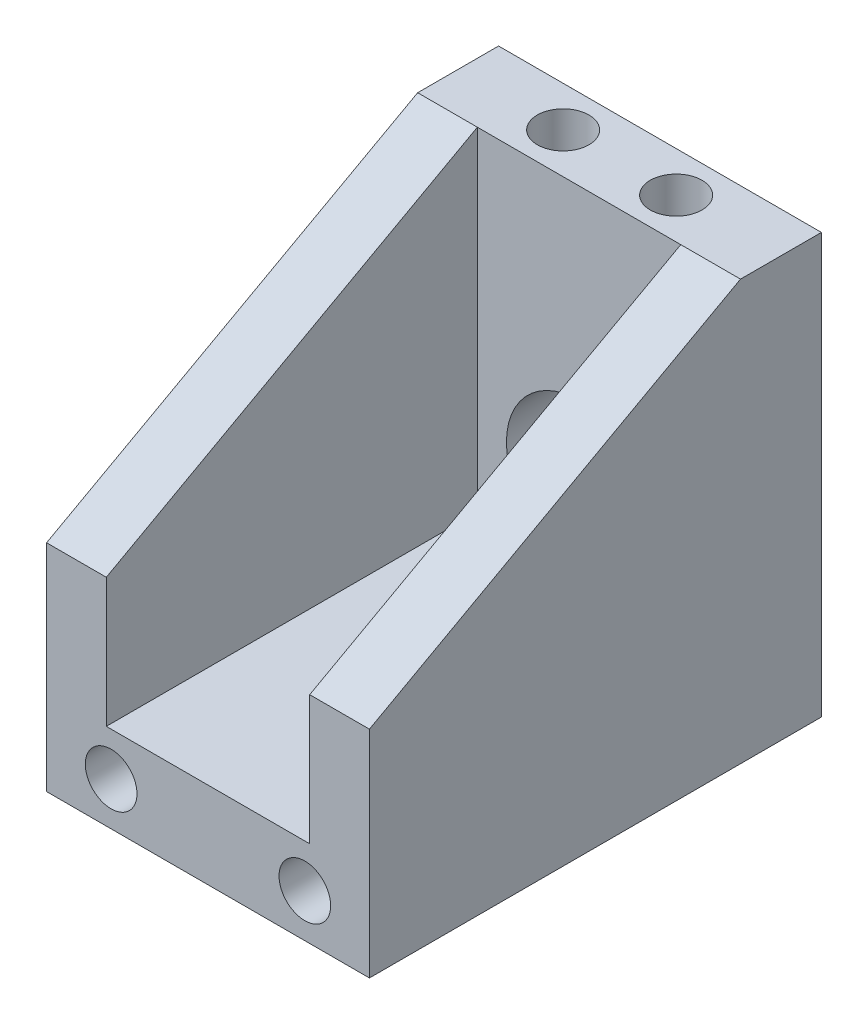
ISO-10303-21;
HEADER;
FILE_DESCRIPTION(('STEP AP214'),'2;1');
FILE_NAME('part.step','',(''),(''),'','','');
FILE_SCHEMA(('AUTOMOTIVE_DESIGN { 1 0 10303 214 1 1 1 1 }'));
ENDSEC;
DATA;
#1=APPLICATION_CONTEXT('core data for automotive mechanical design processes');
#2=APPLICATION_PROTOCOL_DEFINITION('international standard','automotive_design',2000,#1);
#3=PRODUCT_CONTEXT('',#1,'mechanical');
#4=PRODUCT('Part','Part','',(#3));
#5=PRODUCT_RELATED_PRODUCT_CATEGORY('part','',(#4));
#6=PRODUCT_DEFINITION_FORMATION('','',#4);
#7=PRODUCT_DEFINITION_CONTEXT('part definition',#1,'design');
#8=PRODUCT_DEFINITION('design','',#6,#7);
#9=PRODUCT_DEFINITION_SHAPE('','',#8);
#10=(LENGTH_UNIT() NAMED_UNIT(*) SI_UNIT(.MILLI.,.METRE.));
#11=(NAMED_UNIT(*) PLANE_ANGLE_UNIT() SI_UNIT($,.RADIAN.));
#12=(NAMED_UNIT(*) SI_UNIT($,.STERADIAN.) SOLID_ANGLE_UNIT());
#13=UNCERTAINTY_MEASURE_WITH_UNIT(LENGTH_MEASURE(1.E-05),#10,'distance_accuracy_value','');
#14=(GEOMETRIC_REPRESENTATION_CONTEXT(3) GLOBAL_UNCERTAINTY_ASSIGNED_CONTEXT((#13)) GLOBAL_UNIT_ASSIGNED_CONTEXT((#10,
#11,#12)) REPRESENTATION_CONTEXT('',''));
#15=CARTESIAN_POINT('',(0.,0.,0.));
#16=DIRECTION('',(0.,0.,1.));
#17=DIRECTION('',(1.,0.,0.));
#18=AXIS2_PLACEMENT_3D('',#15,#16,#17);
#19=CARTESIAN_POINT('',(-6.39999999999937,6.45000000000001,-2.4));
#20=DIRECTION('',(0.,0.,1.));
#21=DIRECTION('',(1.,0.,0.));
#22=AXIS2_PLACEMENT_3D('',#19,#20,#21);
#23=PLANE('',#22);
#24=CARTESIAN_POINT('',(0.100000000000009,-4.22499999999999,-2.4));
#25=DIRECTION('',(0.,0.,1.));
#26=DIRECTION('',(1.,0.,0.));
#27=AXIS2_PLACEMENT_3D('',#24,#25,#26);
#28=CIRCLE('',#27,1.6);
#29=CARTESIAN_POINT('',(1.70000000000001,-4.22499999999999,-2.4));
#30=VERTEX_POINT('',#29);
#31=EDGE_CURVE('E160',#30,#30,#28,.T.);
#32=ORIENTED_EDGE('',*,*,#31,.F.);
#33=EDGE_LOOP('',(#32));
#34=FACE_BOUND('',#33,.T.);
#35=CARTESIAN_POINT('',(12.1,-4.22499999999998,-2.4));
#36=DIRECTION('',(0.,0.,1.));
#37=DIRECTION('',(1.,0.,0.));
#38=AXIS2_PLACEMENT_3D('',#35,#36,#37);
#39=CIRCLE('',#38,1.6);
#40=CARTESIAN_POINT('',(13.7,-4.22499999999998,-2.4));
#41=VERTEX_POINT('',#40);
#42=EDGE_CURVE('E52',#41,#41,#39,.T.);
#43=ORIENTED_EDGE('',*,*,#42,.F.);
#44=EDGE_LOOP('',(#43));
#45=FACE_BOUND('',#44,.T.);
#46=DIRECTION('',(0.,1.,0.));
#47=VECTOR('',#46,1.);
#48=CARTESIAN_POINT('',(-3.89999999999999,22.2019065307039,-2.4));
#49=LINE('',#48,#47);
#50=CARTESIAN_POINT('',(-3.89999999999999,-6.89999999999999,-2.4));
#51=VERTEX_POINT('',#50);
#52=CARTESIAN_POINT('',(-3.89999999999937,6.45000000000001,-2.40000000000169));
#53=VERTEX_POINT('',#52);
#54=EDGE_CURVE('E129',#51,#53,#49,.T.);
#55=ORIENTED_EDGE('',*,*,#54,.F.);
#56=DIRECTION('',(-1.,0.,0.));
#57=VECTOR('',#56,1.);
#58=CARTESIAN_POINT('',(-3.89999999999999,-6.89999999999999,-2.4));
#59=LINE('',#58,#57);
#60=CARTESIAN_POINT('',(16.1,-6.89999999999999,-2.4));
#61=VERTEX_POINT('',#60);
#62=EDGE_CURVE('E174',#61,#51,#59,.T.);
#63=ORIENTED_EDGE('',*,*,#62,.F.);
#64=DIRECTION('',(0.,-1.,0.));
#65=VECTOR('',#64,1.);
#66=CARTESIAN_POINT('',(16.1,22.2019065307039,-2.4));
#67=LINE('',#66,#65);
#68=CARTESIAN_POINT('',(16.1000000000006,6.45000000000001,-2.4));
#69=VERTEX_POINT('',#68);
#70=EDGE_CURVE('E133',#69,#61,#67,.T.);
#71=ORIENTED_EDGE('',*,*,#70,.F.);
#72=DIRECTION('',(1.,0.,0.));
#73=VECTOR('',#72,1.);
#74=CARTESIAN_POINT('',(-18.500461928358,6.45000000000001,-2.40000000000292));
#75=LINE('',#74,#73);
#76=CARTESIAN_POINT('',(12.4000000000006,6.45000000000001,-2.40000000000031));
#77=VERTEX_POINT('',#76);
#78=EDGE_CURVE('E169',#77,#69,#75,.T.);
#79=ORIENTED_EDGE('',*,*,#78,.F.);
#80=DIRECTION('',(0.,-1.,0.));
#81=VECTOR('',#80,1.);
#82=CARTESIAN_POINT('',(12.4000000000006,-5.89999999999999,-2.4));
#83=LINE('',#82,#81);
#84=CARTESIAN_POINT('',(12.4000000000006,-1.54999999999999,-2.4));
#85=VERTEX_POINT('',#84);
#86=EDGE_CURVE('E134',#77,#85,#83,.T.);
#87=ORIENTED_EDGE('',*,*,#86,.T.);
#88=DIRECTION('',(1.,0.,0.));
#89=VECTOR('',#88,1.);
#90=CARTESIAN_POINT('',(-3.90000000000061,-1.54999999999999,-2.4));
#91=LINE('',#90,#89);
#92=CARTESIAN_POINT('',(-0.200000000000615,-1.54999999999999,-2.4));
#93=VERTEX_POINT('',#92);
#94=EDGE_CURVE('E177',#93,#85,#91,.T.);
#95=ORIENTED_EDGE('',*,*,#94,.F.);
#96=DIRECTION('',(0.,1.,0.));
#97=VECTOR('',#96,1.);
#98=CARTESIAN_POINT('',(-0.200000000000615,-5.89999999999999,-2.4));
#99=LINE('',#98,#97);
#100=CARTESIAN_POINT('',(-0.200000000000609,6.45000000000001,-2.40000000000137));
#101=VERTEX_POINT('',#100);
#102=EDGE_CURVE('E139',#93,#101,#99,.T.);
#103=ORIENTED_EDGE('',*,*,#102,.T.);
#104=DIRECTION('',(-1.,0.,0.));
#105=VECTOR('',#104,1.);
#106=CARTESIAN_POINT('',(30.7004619283561,6.45000000000001,-2.39999999999877));
#107=LINE('',#106,#105);
#108=EDGE_CURVE('E121',#101,#53,#107,.T.);
#109=ORIENTED_EDGE('',*,*,#108,.T.);
#110=EDGE_LOOP('',(#55,#63,#71,#79,#87,#95,#103,#109));
#111=FACE_BOUND('',#110,.T.);
#112=ADVANCED_FACE('F43',(#34,#45,#111),#23,.T.);
#113=CARTESIAN_POINT('',(12.1,-4.22499999999998,-7.4));
#114=DIRECTION('',(0.,0.,1.));
#115=DIRECTION('',(1.,0.,0.));
#116=AXIS2_PLACEMENT_3D('',#113,#114,#115);
#117=PLANE('',#116);
#118=CARTESIAN_POINT('',(12.1,-4.22499999999998,-7.4));
#119=DIRECTION('',(0.,0.,1.));
#120=DIRECTION('',(1.,0.,0.));
#121=AXIS2_PLACEMENT_3D('',#118,#119,#120);
#122=CIRCLE('',#121,1.6);
#123=CARTESIAN_POINT('',(13.7,-4.22499999999998,-7.4));
#124=VERTEX_POINT('',#123);
#125=EDGE_CURVE('E11',#124,#124,#122,.T.);
#126=ORIENTED_EDGE('',*,*,#125,.T.);
#127=EDGE_LOOP('',(#126));
#128=FACE_BOUND('',#127,.T.);
#129=ADVANCED_FACE('F244',(#128),#117,.T.);
#130=CARTESIAN_POINT('',(12.1,-4.22499999999998,-7.4));
#131=DIRECTION('',(0.,0.,1.));
#132=DIRECTION('',(1.,0.,0.));
#133=AXIS2_PLACEMENT_3D('',#130,#131,#132);
#134=CYLINDRICAL_SURFACE('',#133,1.6);
#135=ORIENTED_EDGE('',*,*,#125,.F.);
#136=EDGE_LOOP('',(#135));
#137=FACE_BOUND('',#136,.T.);
#138=ORIENTED_EDGE('',*,*,#42,.T.);
#139=EDGE_LOOP('',(#138));
#140=FACE_BOUND('',#139,.T.);
#141=ADVANCED_FACE('F246',(#137,#140),#134,.F.);
#142=CARTESIAN_POINT('',(0.100000000000009,-4.22499999999999,-7.4));
#143=DIRECTION('',(0.,0.,1.));
#144=DIRECTION('',(1.,0.,0.));
#145=AXIS2_PLACEMENT_3D('',#142,#143,#144);
#146=PLANE('',#145);
#147=CARTESIAN_POINT('',(0.100000000000009,-4.22499999999999,-7.4));
#148=DIRECTION('',(0.,0.,1.));
#149=DIRECTION('',(1.,0.,0.));
#150=AXIS2_PLACEMENT_3D('',#147,#148,#149);
#151=CIRCLE('',#150,1.6);
#152=CARTESIAN_POINT('',(1.70000000000001,-4.22499999999999,-7.4));
#153=VERTEX_POINT('',#152);
#154=EDGE_CURVE('E157',#153,#153,#151,.T.);
#155=ORIENTED_EDGE('',*,*,#154,.T.);
#156=EDGE_LOOP('',(#155));
#157=FACE_BOUND('',#156,.T.);
#158=ADVANCED_FACE('F255',(#157),#146,.T.);
#159=CARTESIAN_POINT('',(0.100000000000009,-4.22499999999999,-7.4));
#160=DIRECTION('',(0.,0.,1.));
#161=DIRECTION('',(1.,0.,0.));
#162=AXIS2_PLACEMENT_3D('',#159,#160,#161);
#163=CYLINDRICAL_SURFACE('',#162,1.6);
#164=ORIENTED_EDGE('',*,*,#154,.F.);
#165=EDGE_LOOP('',(#164));
#166=FACE_BOUND('',#165,.T.);
#167=ORIENTED_EDGE('',*,*,#31,.T.);
#168=EDGE_LOOP('',(#167));
#169=FACE_BOUND('',#168,.T.);
#170=ADVANCED_FACE('F263',(#166,#169),#163,.F.);
#171=CARTESIAN_POINT('',(9.60000000000826,10.9,-27.9));
#172=DIRECTION('',(0.,1.,0.));
#173=DIRECTION('',(-1.,0.,0.));
#174=AXIS2_PLACEMENT_3D('',#171,#172,#173);
#175=PLANE('',#174);
#176=CARTESIAN_POINT('',(9.60000000000826,10.9,-27.9));
#177=DIRECTION('',(0.,1.,0.));
#178=DIRECTION('',(-1.,0.,0.));
#179=AXIS2_PLACEMENT_3D('',#176,#177,#178);
#180=CIRCLE('',#179,1.6);
#181=CARTESIAN_POINT('',(8.00000000000826,10.9,-27.9));
#182=VERTEX_POINT('',#181);
#183=EDGE_CURVE('E207',#182,#182,#180,.T.);
#184=ORIENTED_EDGE('',*,*,#183,.T.);
#185=EDGE_LOOP('',(#184));
#186=FACE_BOUND('',#185,.T.);
#187=ADVANCED_FACE('F266',(#186),#175,.T.);
#188=CARTESIAN_POINT('',(2.60000000000826,10.9,-27.9));
#189=DIRECTION('',(0.,1.,0.));
#190=DIRECTION('',(-1.,0.,0.));
#191=AXIS2_PLACEMENT_3D('',#188,#189,#190);
#192=PLANE('',#191);
#193=CARTESIAN_POINT('',(2.60000000000826,10.9,-27.9));
#194=DIRECTION('',(0.,1.,0.));
#195=DIRECTION('',(-1.,0.,0.));
#196=AXIS2_PLACEMENT_3D('',#193,#194,#195);
#197=CIRCLE('',#196,1.6);
#198=CARTESIAN_POINT('',(1.00000000000826,10.9,-27.9));
#199=VERTEX_POINT('',#198);
#200=EDGE_CURVE('E197',#199,#199,#197,.T.);
#201=ORIENTED_EDGE('',*,*,#200,.T.);
#202=EDGE_LOOP('',(#201));
#203=FACE_BOUND('',#202,.T.);
#204=ADVANCED_FACE('F404',(#203),#192,.T.);
#205=CARTESIAN_POINT('',(6.10000000000064,3.09866035064626,-20.4));
#206=DIRECTION('',(0.,0.,-1.));
#207=DIRECTION('',(-1.,0.,0.));
#208=AXIS2_PLACEMENT_3D('',#205,#206,#207);
#209=CYLINDRICAL_SURFACE('',#208,4.5);
#210=CARTESIAN_POINT('',(6.10000000000064,3.09866035064626,-30.4));
#211=DIRECTION('',(0.,0.,-1.));
#212=DIRECTION('',(-1.,0.,0.));
#213=AXIS2_PLACEMENT_3D('',#210,#211,#212);
#214=CIRCLE('',#213,4.5);
#215=CARTESIAN_POINT('',(1.60000000000064,3.09866035064626,-30.4));
#216=VERTEX_POINT('',#215);
#217=EDGE_CURVE('E148',#216,#216,#214,.T.);
#218=ORIENTED_EDGE('',*,*,#217,.T.);
#219=EDGE_LOOP('',(#218));
#220=FACE_BOUND('',#219,.T.);
#221=CARTESIAN_POINT('',(6.10000000000064,3.09866035064626,-25.3873018726836));
#222=DIRECTION('',(0.,0.,-1.));
#223=DIRECTION('',(-1.,0.,0.));
#224=AXIS2_PLACEMENT_3D('',#221,#222,#223);
#225=CIRCLE('',#224,4.5);
#226=CARTESIAN_POINT('',(1.60000000000064,3.09866035064626,-25.3873018726836));
#227=VERTEX_POINT('',#226);
#228=EDGE_CURVE('E141',#227,#227,#225,.T.);
#229=ORIENTED_EDGE('',*,*,#228,.F.);
#230=EDGE_LOOP('',(#229));
#231=FACE_BOUND('',#230,.T.);
#232=ADVANCED_FACE('F410',(#220,#231),#209,.F.);
#233=CARTESIAN_POINT('',(9.60000000000826,10.9,-27.9));
#234=DIRECTION('',(0.,1.,0.));
#235=DIRECTION('',(-1.,0.,0.));
#236=AXIS2_PLACEMENT_3D('',#233,#234,#235);
#237=CYLINDRICAL_SURFACE('',#236,1.6);
#238=ORIENTED_EDGE('',*,*,#183,.F.);
#239=EDGE_LOOP('',(#238));
#240=FACE_BOUND('',#239,.T.);
#241=CARTESIAN_POINT('',(9.60000000000826,19.1,-27.9));
#242=DIRECTION('',(0.,1.,0.));
#243=DIRECTION('',(-1.,0.,0.));
#244=AXIS2_PLACEMENT_3D('',#241,#242,#243);
#245=CIRCLE('',#244,1.6);
#246=CARTESIAN_POINT('',(8.00000000000826,19.1,-27.9));
#247=VERTEX_POINT('',#246);
#248=EDGE_CURVE('E211',#247,#247,#245,.T.);
#249=ORIENTED_EDGE('',*,*,#248,.T.);
#250=EDGE_LOOP('',(#249));
#251=FACE_BOUND('',#250,.T.);
#252=ADVANCED_FACE('F419',(#240,#251),#237,.F.);
#253=CARTESIAN_POINT('',(2.60000000000826,10.9,-27.9));
#254=DIRECTION('',(0.,1.,0.));
#255=DIRECTION('',(-1.,0.,0.));
#256=AXIS2_PLACEMENT_3D('',#253,#254,#255);
#257=CYLINDRICAL_SURFACE('',#256,1.6);
#258=ORIENTED_EDGE('',*,*,#200,.F.);
#259=EDGE_LOOP('',(#258));
#260=FACE_BOUND('',#259,.T.);
#261=CARTESIAN_POINT('',(2.60000000000826,19.1,-27.9));
#262=DIRECTION('',(0.,1.,0.));
#263=DIRECTION('',(-1.,0.,0.));
#264=AXIS2_PLACEMENT_3D('',#261,#262,#263);
#265=CIRCLE('',#264,1.6);
#266=CARTESIAN_POINT('',(1.00000000000826,19.1,-27.9));
#267=VERTEX_POINT('',#266);
#268=EDGE_CURVE('E214',#267,#267,#265,.T.);
#269=ORIENTED_EDGE('',*,*,#268,.T.);
#270=EDGE_LOOP('',(#269));
#271=FACE_BOUND('',#270,.T.);
#272=ADVANCED_FACE('F281',(#260,#271),#257,.F.);
#273=CARTESIAN_POINT('',(-3.90000000000061,19.1,-25.3873018726836));
#274=DIRECTION('',(0.,0.,-1.));
#275=DIRECTION('',(-1.,0.,0.));
#276=AXIS2_PLACEMENT_3D('',#273,#274,#275);
#277=PLANE('',#276);
#278=ORIENTED_EDGE('',*,*,#228,.T.);
#279=EDGE_LOOP('',(#278));
#280=FACE_BOUND('',#279,.T.);
#281=DIRECTION('',(0.,1.,0.));
#282=VECTOR('',#281,1.);
#283=CARTESIAN_POINT('',(-0.200000000000602,-1.54999999999999,-25.3873018726833));
#284=LINE('',#283,#282);
#285=CARTESIAN_POINT('',(-0.200000000000602,-1.54999999999999,-25.3873018726833));
#286=VERTEX_POINT('',#285);
#287=CARTESIAN_POINT('',(-0.200000000000603,19.1,-25.3873018726836));
#288=VERTEX_POINT('',#287);
#289=EDGE_CURVE('E226',#286,#288,#284,.T.);
#290=ORIENTED_EDGE('',*,*,#289,.F.);
#291=DIRECTION('',(1.,0.,0.));
#292=VECTOR('',#291,1.);
#293=CARTESIAN_POINT('',(-3.90000000000061,-1.54999999999999,-25.3873018726836));
#294=LINE('',#293,#292);
#295=CARTESIAN_POINT('',(12.4000000000006,-1.54999999999999,-25.3873018726865));
#296=VERTEX_POINT('',#295);
#297=EDGE_CURVE('E194',#286,#296,#294,.T.);
#298=ORIENTED_EDGE('',*,*,#297,.T.);
#299=DIRECTION('',(0.,-1.,0.));
#300=VECTOR('',#299,1.);
#301=CARTESIAN_POINT('',(12.4000000000006,19.1,-25.3873018726839));
#302=LINE('',#301,#300);
#303=CARTESIAN_POINT('',(12.4000000000006,19.1000000000014,-25.3873018726865));
#304=VERTEX_POINT('',#303);
#305=EDGE_CURVE('E173',#304,#296,#302,.T.);
#306=ORIENTED_EDGE('',*,*,#305,.F.);
#307=DIRECTION('',(1.,0.,0.));
#308=VECTOR('',#307,1.);
#309=CARTESIAN_POINT('',(-3.90000000000061,19.1,-25.3873018726836));
#310=LINE('',#309,#308);
#311=EDGE_CURVE('E205',#288,#304,#310,.T.);
#312=ORIENTED_EDGE('',*,*,#311,.F.);
#313=EDGE_LOOP('',(#290,#298,#306,#312));
#314=FACE_BOUND('',#313,.T.);
#315=ADVANCED_FACE('F273',(#280,#314),#277,.F.);
#316=CARTESIAN_POINT('',(-3.90000000000061,-1.54999999999999,25.4675963415358));
#317=DIRECTION('',(0.,1.,0.));
#318=DIRECTION('',(-1.,0.,0.));
#319=AXIS2_PLACEMENT_3D('',#316,#317,#318);
#320=PLANE('',#319);
#321=DIRECTION('',(0.,0.,-1.));
#322=VECTOR('',#321,1.);
#323=CARTESIAN_POINT('',(-0.200000000000615,-1.54999999999999,-2.4));
#324=LINE('',#323,#322);
#325=EDGE_CURVE('E176',#93,#286,#324,.T.);
#326=ORIENTED_EDGE('',*,*,#325,.F.);
#327=ORIENTED_EDGE('',*,*,#94,.T.);
#328=DIRECTION('',(0.,0.,1.));
#329=VECTOR('',#328,1.);
#330=CARTESIAN_POINT('',(12.4000000000006,-1.54999999999999,-2.4));
#331=LINE('',#330,#329);
#332=EDGE_CURVE('E151',#296,#85,#331,.T.);
#333=ORIENTED_EDGE('',*,*,#332,.F.);
#334=ORIENTED_EDGE('',*,*,#297,.F.);
#335=EDGE_LOOP('',(#326,#327,#333,#334));
#336=FACE_BOUND('',#335,.T.);
#337=ADVANCED_FACE('F270',(#336),#320,.T.);
#338=CARTESIAN_POINT('',(0.,0.,-30.4));
#339=DIRECTION('',(0.,0.,-1.));
#340=DIRECTION('',(-1.,0.,0.));
#341=AXIS2_PLACEMENT_3D('',#338,#339,#340);
#342=PLANE('',#341);
#343=ORIENTED_EDGE('',*,*,#217,.F.);
#344=EDGE_LOOP('',(#343));
#345=FACE_BOUND('',#344,.T.);
#346=DIRECTION('',(0.,1.,0.));
#347=VECTOR('',#346,1.);
#348=CARTESIAN_POINT('',(-3.90000000000061,-5.89999999999999,-30.4));
#349=LINE('',#348,#347);
#350=CARTESIAN_POINT('',(-3.89999999999999,-6.89999999999999,-30.4));
#351=VERTEX_POINT('',#350);
#352=CARTESIAN_POINT('',(-3.90000000000061,19.1,-30.4));
#353=VERTEX_POINT('',#352);
#354=EDGE_CURVE('E68',#351,#353,#349,.T.);
#355=ORIENTED_EDGE('',*,*,#354,.T.);
#356=DIRECTION('',(-1.,0.,0.));
#357=VECTOR('',#356,1.);
#358=CARTESIAN_POINT('',(-3.90000000000061,19.1,-30.4));
#359=LINE('',#358,#357);
#360=CARTESIAN_POINT('',(16.1000000000006,19.1,-30.4));
#361=VERTEX_POINT('',#360);
#362=EDGE_CURVE('E190',#361,#353,#359,.T.);
#363=ORIENTED_EDGE('',*,*,#362,.F.);
#364=DIRECTION('',(0.,-1.,0.));
#365=VECTOR('',#364,1.);
#366=CARTESIAN_POINT('',(16.1000000000006,-5.89999999999999,-30.4));
#367=LINE('',#366,#365);
#368=CARTESIAN_POINT('',(16.1,-6.89999999999999,-30.4));
#369=VERTEX_POINT('',#368);
#370=EDGE_CURVE('E60',#361,#369,#367,.T.);
#371=ORIENTED_EDGE('',*,*,#370,.T.);
#372=DIRECTION('',(1.,0.,0.));
#373=VECTOR('',#372,1.);
#374=CARTESIAN_POINT('',(-3.89999999999999,-6.89999999999999,-30.4));
#375=LINE('',#374,#373);
#376=EDGE_CURVE('E154',#351,#369,#375,.T.);
#377=ORIENTED_EDGE('',*,*,#376,.F.);
#378=EDGE_LOOP('',(#355,#363,#371,#377));
#379=FACE_BOUND('',#378,.T.);
#380=ADVANCED_FACE('F272',(#345,#379),#342,.T.);
#381=CARTESIAN_POINT('',(-3.89999999999999,22.2019065307039,-22.7888699339858));
#382=DIRECTION('',(-1.,0.,0.));
#383=DIRECTION('',(0.,0.,1.));
#384=AXIS2_PLACEMENT_3D('',#381,#382,#383);
#385=PLANE('',#384);
#386=DIRECTION('',(0.,0.,1.));
#387=VECTOR('',#386,1.);
#388=CARTESIAN_POINT('',(-3.89999999999999,-6.89999999999999,-50.4249843945008));
#389=LINE('',#388,#387);
#390=EDGE_CURVE('E125',#351,#51,#389,.T.);
#391=ORIENTED_EDGE('',*,*,#390,.T.);
#392=ORIENTED_EDGE('',*,*,#54,.T.);
#393=DIRECTION('',(0.,0.482123094853901,-0.87610348784176));
#394=VECTOR('',#393,1.);
#395=CARTESIAN_POINT('',(-3.89999999999743,19.1,-25.3873018726836));
#396=LINE('',#395,#394);
#397=CARTESIAN_POINT('',(-3.89999999999743,19.1,-25.3873018726836));
#398=VERTEX_POINT('',#397);
#399=EDGE_CURVE('E117',#53,#398,#396,.T.);
#400=ORIENTED_EDGE('',*,*,#399,.T.);
#401=DIRECTION('',(0.,0.,1.));
#402=VECTOR('',#401,1.);
#403=CARTESIAN_POINT('',(-3.90000000000061,19.1,-30.4));
#404=LINE('',#403,#402);
#405=EDGE_CURVE('E198',#353,#398,#404,.T.);
#406=ORIENTED_EDGE('',*,*,#405,.F.);
#407=ORIENTED_EDGE('',*,*,#354,.F.);
#408=EDGE_LOOP('',(#391,#392,#400,#406,#407));
#409=FACE_BOUND('',#408,.T.);
#410=ADVANCED_FACE('F130',(#409),#385,.T.);
#411=CARTESIAN_POINT('',(0.,19.1,0.));
#412=DIRECTION('',(0.,1.,0.));
#413=DIRECTION('',(-1.,0.,0.));
#414=AXIS2_PLACEMENT_3D('',#411,#412,#413);
#415=PLANE('',#414);
#416=ORIENTED_EDGE('',*,*,#268,.F.);
#417=EDGE_LOOP('',(#416));
#418=FACE_BOUND('',#417,.T.);
#419=ORIENTED_EDGE('',*,*,#248,.F.);
#420=EDGE_LOOP('',(#419));
#421=FACE_BOUND('',#420,.T.);
#422=ORIENTED_EDGE('',*,*,#405,.T.);
#423=EDGE_CURVE('E123',#398,#288,#310,.T.);
#424=ORIENTED_EDGE('',*,*,#423,.T.);
#425=ORIENTED_EDGE('',*,*,#311,.T.);
#426=DIRECTION('',(1.,0.,0.));
#427=VECTOR('',#426,1.);
#428=CARTESIAN_POINT('',(-18.5004619283561,19.1,-25.3873018726865));
#429=LINE('',#428,#427);
#430=CARTESIAN_POINT('',(16.1000000000006,19.1,-25.3873018726836));
#431=VERTEX_POINT('',#430);
#432=EDGE_CURVE('E172',#304,#431,#429,.T.);
#433=ORIENTED_EDGE('',*,*,#432,.T.);
#434=DIRECTION('',(0.,0.,-1.));
#435=VECTOR('',#434,1.);
#436=CARTESIAN_POINT('',(16.1000000000006,19.1,-30.4));
#437=LINE('',#436,#435);
#438=EDGE_CURVE('E201',#431,#361,#437,.T.);
#439=ORIENTED_EDGE('',*,*,#438,.T.);
#440=ORIENTED_EDGE('',*,*,#362,.T.);
#441=EDGE_LOOP('',(#422,#424,#425,#433,#439,#440));
#442=FACE_BOUND('',#441,.T.);
#443=ADVANCED_FACE('F231',(#418,#421,#442),#415,.T.);
#444=CARTESIAN_POINT('',(-0.200000000000615,-5.89999999999999,-2.4));
#445=DIRECTION('',(-1.,0.,0.));
#446=DIRECTION('',(0.,0.,1.));
#447=AXIS2_PLACEMENT_3D('',#444,#445,#446);
#448=PLANE('',#447);
#449=ORIENTED_EDGE('',*,*,#102,.F.);
#450=ORIENTED_EDGE('',*,*,#325,.T.);
#451=ORIENTED_EDGE('',*,*,#289,.T.);
#452=DIRECTION('',(0.,-0.482123094853901,0.87610348784176));
#453=VECTOR('',#452,1.);
#454=CARTESIAN_POINT('',(-0.200000000000602,19.0999999999989,-25.3873018726813));
#455=LINE('',#454,#453);
#456=EDGE_CURVE('E126',#288,#101,#455,.T.);
#457=ORIENTED_EDGE('',*,*,#456,.T.);
#458=EDGE_LOOP('',(#449,#450,#451,#457));
#459=FACE_BOUND('',#458,.T.);
#460=ADVANCED_FACE('F229',(#459),#448,.F.);
#461=CARTESIAN_POINT('',(30.700461928358,19.1,-25.3873018726806));
#462=DIRECTION('',(0.,0.87610348784176,0.482123094853901));
#463=DIRECTION('',(0.,-0.482123094853901,0.87610348784176));
#464=AXIS2_PLACEMENT_3D('',#461,#462,#463);
#465=PLANE('',#464);
#466=ORIENTED_EDGE('',*,*,#456,.F.);
#467=ORIENTED_EDGE('',*,*,#423,.F.);
#468=ORIENTED_EDGE('',*,*,#399,.F.);
#469=ORIENTED_EDGE('',*,*,#108,.F.);
#470=EDGE_LOOP('',(#466,#467,#468,#469));
#471=FACE_BOUND('',#470,.T.);
#472=ADVANCED_FACE('F119',(#471),#465,.T.);
#473=CARTESIAN_POINT('',(16.1,22.2019065307039,-22.7888699339858));
#474=DIRECTION('',(1.,0.,0.));
#475=DIRECTION('',(0.,0.,-1.));
#476=AXIS2_PLACEMENT_3D('',#473,#474,#475);
#477=PLANE('',#476);
#478=DIRECTION('',(0.,-0.482123094853874,0.876103487841775));
#479=VECTOR('',#478,1.);
#480=CARTESIAN_POINT('',(16.1000000000006,6.45000000000001,-2.4));
#481=LINE('',#480,#479);
#482=EDGE_CURVE('E223',#431,#69,#481,.T.);
#483=ORIENTED_EDGE('',*,*,#482,.T.);
#484=ORIENTED_EDGE('',*,*,#70,.T.);
#485=DIRECTION('',(0.,0.,1.));
#486=VECTOR('',#485,1.);
#487=CARTESIAN_POINT('',(16.1,-6.89999999999999,-50.4249843945008));
#488=LINE('',#487,#486);
#489=EDGE_CURVE('E47',#369,#61,#488,.T.);
#490=ORIENTED_EDGE('',*,*,#489,.F.);
#491=ORIENTED_EDGE('',*,*,#370,.F.);
#492=ORIENTED_EDGE('',*,*,#438,.F.);
#493=EDGE_LOOP('',(#483,#484,#490,#491,#492));
#494=FACE_BOUND('',#493,.T.);
#495=ADVANCED_FACE('F237',(#494),#477,.T.);
#496=CARTESIAN_POINT('',(12.4000000000006,-5.89999999999999,-2.4));
#497=DIRECTION('',(1.,0.,0.));
#498=DIRECTION('',(0.,0.,-1.));
#499=AXIS2_PLACEMENT_3D('',#496,#497,#498);
#500=PLANE('',#499);
#501=ORIENTED_EDGE('',*,*,#86,.F.);
#502=DIRECTION('',(0.,0.482123094853874,-0.876103487841775));
#503=VECTOR('',#502,1.);
#504=CARTESIAN_POINT('',(12.4000000000006,6.45000000000111,-2.40000000000231));
#505=LINE('',#504,#503);
#506=EDGE_CURVE('E210',#77,#304,#505,.T.);
#507=ORIENTED_EDGE('',*,*,#506,.T.);
#508=ORIENTED_EDGE('',*,*,#305,.T.);
#509=ORIENTED_EDGE('',*,*,#332,.T.);
#510=EDGE_LOOP('',(#501,#507,#508,#509));
#511=FACE_BOUND('',#510,.T.);
#512=ADVANCED_FACE('F286',(#511),#500,.F.);
#513=CARTESIAN_POINT('',(-18.500461928358,6.45000000000001,-2.40000000000292));
#514=DIRECTION('',(0.,0.876103487841775,0.482123094853874));
#515=DIRECTION('',(0.,-0.482123094853874,0.876103487841775));
#516=AXIS2_PLACEMENT_3D('',#513,#514,#515);
#517=PLANE('',#516);
#518=ORIENTED_EDGE('',*,*,#506,.F.);
#519=ORIENTED_EDGE('',*,*,#78,.T.);
#520=ORIENTED_EDGE('',*,*,#482,.F.);
#521=ORIENTED_EDGE('',*,*,#432,.F.);
#522=EDGE_LOOP('',(#518,#519,#520,#521));
#523=FACE_BOUND('',#522,.T.);
#524=ADVANCED_FACE('F289',(#523),#517,.T.);
#525=CARTESIAN_POINT('',(-3.89999999999999,-6.89999999999999,-50.4249843945008));
#526=DIRECTION('',(0.,-1.,0.));
#527=DIRECTION('',(0.,0.,-1.));
#528=AXIS2_PLACEMENT_3D('',#525,#526,#527);
#529=PLANE('',#528);
#530=ORIENTED_EDGE('',*,*,#489,.T.);
#531=ORIENTED_EDGE('',*,*,#62,.T.);
#532=ORIENTED_EDGE('',*,*,#390,.F.);
#533=ORIENTED_EDGE('',*,*,#376,.T.);
#534=EDGE_LOOP('',(#530,#531,#532,#533));
#535=FACE_BOUND('',#534,.T.);
#536=ADVANCED_FACE('F45',(#535),#529,.T.);
#537=CLOSED_SHELL('',(#112,#129,#141,#158,#170,#187,#204,#232,#252,#272,#315,#337,#380,#410,
#443,#460,#472,#495,#512,#524,#536));
#538=MANIFOLD_SOLID_BREP('B2',#537);
#539=ADVANCED_BREP_SHAPE_REPRESENTATION('',(#18,#538),#14);
#540=SHAPE_DEFINITION_REPRESENTATION(#9,#539);
ENDSEC;
END-ISO-10303-21;
